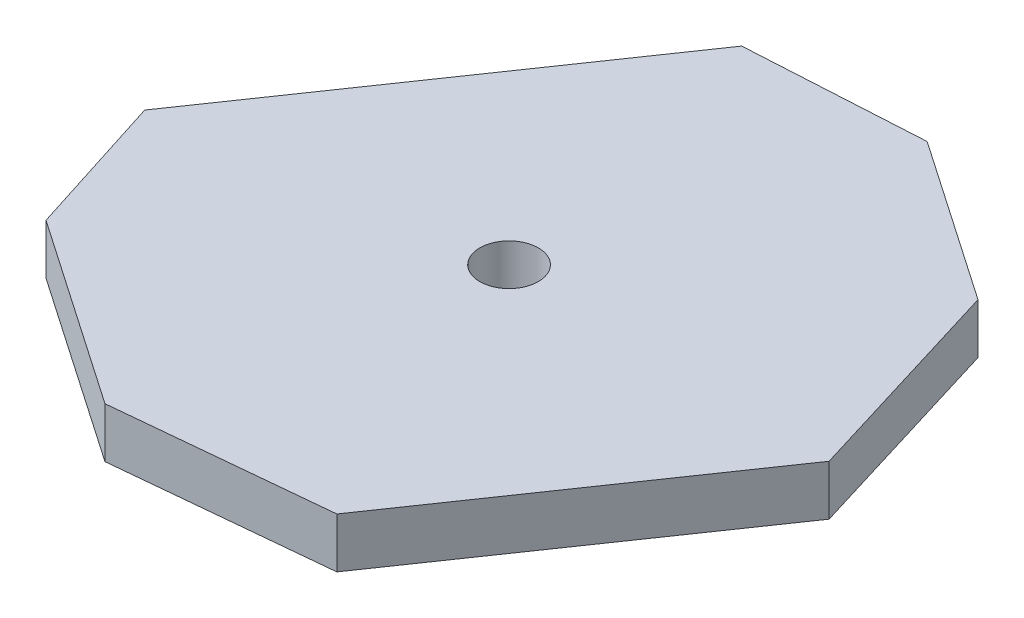
ISO-10303-21;
HEADER;
FILE_DESCRIPTION(('STEP AP214'),'2;1');
FILE_NAME('part.step','',(''),(''),'','','');
FILE_SCHEMA(('AUTOMOTIVE_DESIGN { 1 0 10303 214 1 1 1 1 }'));
ENDSEC;
DATA;
#1=APPLICATION_CONTEXT('core data for automotive mechanical design processes');
#2=APPLICATION_PROTOCOL_DEFINITION('international standard','automotive_design',2000,#1);
#3=PRODUCT_CONTEXT('',#1,'mechanical');
#4=PRODUCT('Part','Part','',(#3));
#5=PRODUCT_RELATED_PRODUCT_CATEGORY('part','',(#4));
#6=PRODUCT_DEFINITION_FORMATION('','',#4);
#7=PRODUCT_DEFINITION_CONTEXT('part definition',#1,'design');
#8=PRODUCT_DEFINITION('design','',#6,#7);
#9=PRODUCT_DEFINITION_SHAPE('','',#8);
#10=(LENGTH_UNIT() NAMED_UNIT(*) SI_UNIT(.MILLI.,.METRE.));
#11=(NAMED_UNIT(*) PLANE_ANGLE_UNIT() SI_UNIT($,.RADIAN.));
#12=(NAMED_UNIT(*) SI_UNIT($,.STERADIAN.) SOLID_ANGLE_UNIT());
#13=UNCERTAINTY_MEASURE_WITH_UNIT(LENGTH_MEASURE(1.E-05),#10,'distance_accuracy_value','');
#14=(GEOMETRIC_REPRESENTATION_CONTEXT(3) GLOBAL_UNCERTAINTY_ASSIGNED_CONTEXT((#13)) GLOBAL_UNIT_ASSIGNED_CONTEXT((#10,
#11,#12)) REPRESENTATION_CONTEXT('',''));
#15=CARTESIAN_POINT('',(0.,0.,0.));
#16=DIRECTION('',(0.,0.,1.));
#17=DIRECTION('',(1.,0.,0.));
#18=AXIS2_PLACEMENT_3D('',#15,#16,#17);
#19=CARTESIAN_POINT('',(0.,20.,0.));
#20=DIRECTION('',(0.,-1.,0.));
#21=DIRECTION('',(0.,0.,-1.));
#22=AXIS2_PLACEMENT_3D('',#19,#20,#21);
#23=CYLINDRICAL_SURFACE('',#22,9.);
#24=CARTESIAN_POINT('',(0.,7.,0.));
#25=DIRECTION('',(0.,1.,0.));
#26=DIRECTION('',(0.,0.,1.));
#27=AXIS2_PLACEMENT_3D('',#24,#25,#26);
#28=CIRCLE('',#27,9.);
#29=CARTESIAN_POINT('',(0.,7.,-9.));
#30=VERTEX_POINT('',#29);
#31=EDGE_CURVE('E148',#30,#30,#28,.T.);
#32=CARTESIAN_POINT('',(0.,12.,0.));
#33=DIRECTION('',(0.,1.,0.));
#34=DIRECTION('',(0.,0.,1.));
#35=AXIS2_PLACEMENT_3D('',#32,#33,#34);
#36=CIRCLE('',#35,9.);
#37=CARTESIAN_POINT('',(0.,12.,-9.));
#38=VERTEX_POINT('',#37);
#39=EDGE_CURVE('E189',#38,#38,#36,.T.);
#40=CARTESIAN_POINT('',(0.,7.,-9.));
#41=CARTESIAN_POINT('',(0.,7.05208333333333,-9.));
#42=CARTESIAN_POINT('',(0.,7.10416666666667,-9.));
#43=CARTESIAN_POINT('',(0.,7.20833333333333,-9.));
#44=CARTESIAN_POINT('',(0.,7.26041666666667,-9.));
#45=CARTESIAN_POINT('',(0.,7.36458333333333,-9.));
#46=CARTESIAN_POINT('',(0.,7.41666666666667,-9.));
#47=CARTESIAN_POINT('',(0.,7.52083333333333,-9.));
#48=CARTESIAN_POINT('',(0.,7.57291666666667,-9.));
#49=CARTESIAN_POINT('',(0.,7.67708333333333,-9.));
#50=CARTESIAN_POINT('',(0.,7.72916666666667,-9.));
#51=CARTESIAN_POINT('',(0.,7.83333333333333,-9.));
#52=CARTESIAN_POINT('',(0.,7.88541666666667,-9.));
#53=CARTESIAN_POINT('',(0.,7.98958333333333,-9.));
#54=CARTESIAN_POINT('',(0.,8.04166666666667,-9.));
#55=CARTESIAN_POINT('',(0.,8.14583333333333,-9.));
#56=CARTESIAN_POINT('',(0.,8.19791666666667,-9.));
#57=CARTESIAN_POINT('',(0.,8.30208333333333,-9.));
#58=CARTESIAN_POINT('',(0.,8.35416666666667,-9.));
#59=CARTESIAN_POINT('',(0.,8.45833333333333,-9.));
#60=CARTESIAN_POINT('',(0.,8.51041666666667,-9.));
#61=CARTESIAN_POINT('',(0.,8.61458333333333,-9.));
#62=CARTESIAN_POINT('',(0.,8.66666666666667,-9.));
#63=CARTESIAN_POINT('',(0.,8.77083333333333,-9.));
#64=CARTESIAN_POINT('',(0.,8.82291666666667,-9.));
#65=CARTESIAN_POINT('',(0.,8.92708333333333,-9.));
#66=CARTESIAN_POINT('',(0.,8.97916666666667,-9.));
#67=CARTESIAN_POINT('',(0.,9.08333333333333,-9.));
#68=CARTESIAN_POINT('',(0.,9.13541666666667,-9.));
#69=CARTESIAN_POINT('',(0.,9.23958333333333,-9.));
#70=CARTESIAN_POINT('',(0.,9.29166666666667,-9.));
#71=CARTESIAN_POINT('',(0.,9.39583333333333,-9.));
#72=CARTESIAN_POINT('',(0.,9.44791666666667,-9.));
#73=CARTESIAN_POINT('',(0.,9.55208333333333,-9.));
#74=CARTESIAN_POINT('',(0.,9.60416666666667,-9.));
#75=CARTESIAN_POINT('',(0.,9.70833333333333,-9.));
#76=CARTESIAN_POINT('',(0.,9.76041666666667,-9.));
#77=CARTESIAN_POINT('',(0.,9.86458333333333,-9.));
#78=CARTESIAN_POINT('',(0.,9.91666666666667,-9.));
#79=CARTESIAN_POINT('',(0.,10.0208333333333,-9.));
#80=CARTESIAN_POINT('',(0.,10.0729166666667,-9.));
#81=CARTESIAN_POINT('',(0.,10.1770833333333,-9.));
#82=CARTESIAN_POINT('',(0.,10.2291666666667,-9.));
#83=CARTESIAN_POINT('',(0.,10.3333333333333,-9.));
#84=CARTESIAN_POINT('',(0.,10.3854166666667,-9.));
#85=CARTESIAN_POINT('',(0.,10.4895833333333,-9.));
#86=CARTESIAN_POINT('',(0.,10.5416666666667,-9.));
#87=CARTESIAN_POINT('',(0.,10.6458333333333,-9.));
#88=CARTESIAN_POINT('',(0.,10.6979166666667,-9.));
#89=CARTESIAN_POINT('',(0.,10.8020833333333,-9.));
#90=CARTESIAN_POINT('',(0.,10.8541666666667,-9.));
#91=CARTESIAN_POINT('',(0.,10.9583333333333,-9.));
#92=CARTESIAN_POINT('',(0.,11.0104166666667,-9.));
#93=CARTESIAN_POINT('',(0.,11.1145833333333,-9.));
#94=CARTESIAN_POINT('',(0.,11.1666666666667,-9.));
#95=CARTESIAN_POINT('',(0.,11.2708333333333,-9.));
#96=CARTESIAN_POINT('',(0.,11.3229166666667,-9.));
#97=CARTESIAN_POINT('',(0.,11.4270833333333,-9.));
#98=CARTESIAN_POINT('',(0.,11.4791666666667,-9.));
#99=CARTESIAN_POINT('',(0.,11.5833333333333,-9.));
#100=CARTESIAN_POINT('',(0.,11.6354166666667,-9.));
#101=CARTESIAN_POINT('',(0.,11.7395833333333,-9.));
#102=CARTESIAN_POINT('',(0.,11.7916666666667,-9.));
#103=CARTESIAN_POINT('',(0.,11.8958333333333,-9.));
#104=CARTESIAN_POINT('',(0.,11.9479166666667,-9.));
#105=CARTESIAN_POINT('',(0.,12.,-9.));
#106=B_SPLINE_CURVE_WITH_KNOTS('',3,(#40,#41,#42,#43,#44,#45,#46,#47,#48,#49,#50,#51,#52,#53,
#54,#55,#56,#57,#58,#59,#60,#61,#62,#63,#64,#65,#66,#67,#68,#69,#70,#71,#72,#73,#74,#75,#76,#77,
#78,#79,#80,#81,#82,#83,#84,#85,#86,#87,#88,#89,#90,#91,#92,#93,#94,#95,#96,#97,#98,#99,#100,
#101,#102,#103,#104,#105),.UNSPECIFIED.,.F.,.F.,(4,2,2,2,2,2,2,2,2,2,2,2,2,2,2,2,2,2,2,2,2,2,2,
2,2,2,2,2,2,2,2,2,4),(0.,0.15625,0.3125,0.46875,0.625000000000001,0.781249999999999,
0.937499999999999,1.09375,1.25,1.40625,1.5625,1.71875,1.875,2.03125,2.1875,2.34375,2.5,2.65625,
2.8125,2.96875,3.125,3.28125,3.4375,3.59375,3.75,3.90625,4.0625,4.21875,4.375,4.53125,4.6875,
4.84375,5.),.UNSPECIFIED.);
#107=EDGE_CURVE('BSEAM31',#30,#38,#106,.T.);
#108=ORIENTED_EDGE('',*,*,#31,.F.);
#109=ORIENTED_EDGE('',*,*,#39,.T.);
#110=ORIENTED_EDGE('',*,*,#107,.T.);
#111=ORIENTED_EDGE('',*,*,#107,.F.);
#112=EDGE_LOOP('',(#108,#110,#109,#111));
#113=FACE_BOUND('',#112,.T.);
#114=ADVANCED_FACE('F31',(#113),#23,.F.);
#115=CARTESIAN_POINT('',(0.,20.,0.));
#116=DIRECTION('',(0.,1.,0.));
#117=DIRECTION('',(0.,0.,1.));
#118=AXIS2_PLACEMENT_3D('',#115,#116,#117);
#119=PLANE('',#118);
#120=DIRECTION('',(-0.998353627598779,0.,0.057358820249011));
#121=VECTOR('',#120,1.);
#122=CARTESIAN_POINT('',(-8.73290988352039,20.,-36.5474704589782));
#123=LINE('',#122,#121);
#124=CARTESIAN_POINT('',(12.2357602972844,20.,-37.7521920631401));
#125=VERTEX_POINT('',#124);
#126=CARTESIAN_POINT('',(-8.73290988352039,20.,-36.5474704589782));
#127=VERTEX_POINT('',#126);
#128=EDGE_CURVE('E132',#125,#127,#123,.T.);
#129=ORIENTED_EDGE('',*,*,#128,.T.);
#130=DIRECTION('',(-0.566202026854312,0.,0.824266501069932));
#131=VECTOR('',#130,1.);
#132=CARTESIAN_POINT('',(-37.7975580707269,20.,5.76431001838409));
#133=LINE('',#132,#131);
#134=CARTESIAN_POINT('',(-37.7975580707269,20.,5.76431001838409));
#135=VERTEX_POINT('',#134);
#136=EDGE_CURVE('E121',#127,#135,#133,.T.);
#137=ORIENTED_EDGE('',*,*,#136,.T.);
#138=DIRECTION('',(0.303356932104085,0.,0.952876997174556));
#139=VECTOR('',#138,1.);
#140=CARTESIAN_POINT('',(-32.2858374379566,20.,23.0772218064594));
#141=LINE('',#140,#139);
#142=CARTESIAN_POINT('',(-32.2858374379566,20.,23.0772218064594));
#143=VERTEX_POINT('',#142);
#144=EDGE_CURVE('E119',#135,#143,#141,.T.);
#145=ORIENTED_EDGE('',*,*,#144,.T.);
#146=DIRECTION('',(0.824266501069933,0.,0.566202026854312));
#147=VECTOR('',#146,1.);
#148=CARTESIAN_POINT('',(-9.7668889099382,20.,38.5458527439554));
#149=LINE('',#148,#147);
#150=CARTESIAN_POINT('',(-9.7668889099382,20.,38.5458527439554));
#151=VERTEX_POINT('',#150);
#152=EDGE_CURVE('E46',#143,#151,#149,.T.);
#153=ORIENTED_EDGE('',*,*,#152,.T.);
#154=DIRECTION('',(0.995356215545695,0.,-0.0962600860925825));
#155=VECTOR('',#154,1.);
#156=CARTESIAN_POINT('',(-9.7668889099382,20.,38.5458527439554));
#157=LINE('',#156,#155);
#158=CARTESIAN_POINT('',(15.5126441693851,20.,36.1010897610249));
#159=VERTEX_POINT('',#158);
#160=EDGE_CURVE('E106',#151,#159,#157,.T.);
#161=ORIENTED_EDGE('',*,*,#160,.T.);
#162=DIRECTION('',(0.566202026854312,0.,-0.824266501069932));
#163=VECTOR('',#162,1.);
#164=CARTESIAN_POINT('',(15.5126441693851,20.,36.1010897610249));
#165=LINE('',#164,#163);
#166=CARTESIAN_POINT('',(39.4774671890436,20.,1.21354100229039));
#167=VERTEX_POINT('',#166);
#168=EDGE_CURVE('E112',#159,#167,#165,.T.);
#169=ORIENTED_EDGE('',*,*,#168,.T.);
#170=DIRECTION('',(-0.292112381317612,0.,-0.956384000640409));
#171=VECTOR('',#170,1.);
#172=CARTESIAN_POINT('',(39.4774671890436,20.,1.21354100229039));
#173=LINE('',#172,#171);
#174=CARTESIAN_POINT('',(31.6490594515686,20.,-24.4168820453041));
#175=VERTEX_POINT('',#174);
#176=EDGE_CURVE('E126',#167,#175,#173,.T.);
#177=ORIENTED_EDGE('',*,*,#176,.T.);
#178=DIRECTION('',(-0.824266501069941,0.,-0.566202026854299));
#179=VECTOR('',#178,1.);
#180=CARTESIAN_POINT('',(31.6490594515686,20.,-24.4168820453041));
#181=LINE('',#180,#179);
#182=EDGE_CURVE('E129',#175,#125,#181,.T.);
#183=ORIENTED_EDGE('',*,*,#182,.T.);
#184=EDGE_LOOP('',(#129,#137,#145,#153,#161,#169,#177,#183));
#185=FACE_BOUND('',#184,.T.);
#186=CARTESIAN_POINT('',(0.,20.,0.));
#187=DIRECTION('',(0.,1.,0.));
#188=DIRECTION('',(0.,0.,1.));
#189=AXIS2_PLACEMENT_3D('',#186,#187,#188);
#190=CIRCLE('',#189,3.5);
#191=CARTESIAN_POINT('',(0.,20.,3.5));
#192=VERTEX_POINT('',#191);
#193=EDGE_CURVE('E194',#192,#192,#190,.T.);
#194=ORIENTED_EDGE('',*,*,#193,.F.);
#195=EDGE_LOOP('',(#194));
#196=FACE_BOUND('',#195,.T.);
#197=ADVANCED_FACE('F116',(#185,#196),#119,.T.);
#198=CARTESIAN_POINT('',(0.,14.,0.));
#199=DIRECTION('',(0.,-1.,0.));
#200=DIRECTION('',(0.,0.,-1.));
#201=AXIS2_PLACEMENT_3D('',#198,#199,#200);
#202=PLANE('',#201);
#203=CARTESIAN_POINT('',(0.,14.,0.));
#204=DIRECTION('',(0.,-1.,0.));
#205=DIRECTION('',(0.,0.,-1.));
#206=AXIS2_PLACEMENT_3D('',#203,#204,#205);
#207=CIRCLE('',#206,25.);
#208=CARTESIAN_POINT('',(0.,14.,-25.));
#209=VERTEX_POINT('',#208);
#210=EDGE_CURVE('E11',#209,#209,#207,.F.);
#211=ORIENTED_EDGE('',*,*,#210,.T.);
#212=EDGE_LOOP('',(#211));
#213=FACE_BOUND('',#212,.T.);
#214=DIRECTION('',(-0.303356932104085,0.,-0.952876997174556));
#215=VECTOR('',#214,1.);
#216=CARTESIAN_POINT('',(-35.9854636771118,14.,11.4562948773039));
#217=LINE('',#216,#215);
#218=CARTESIAN_POINT('',(-32.2858374379566,14.,23.0772218064594));
#219=VERTEX_POINT('',#218);
#220=CARTESIAN_POINT('',(-37.7975580707269,14.,5.76431001838409));
#221=VERTEX_POINT('',#220);
#222=EDGE_CURVE('E151',#219,#221,#217,.T.);
#223=ORIENTED_EDGE('',*,*,#222,.T.);
#224=DIRECTION('',(0.566202026854312,0.,-0.824266501069932));
#225=VECTOR('',#224,1.);
#226=CARTESIAN_POINT('',(-22.9900265792471,14.,-15.7922220904375));
#227=LINE('',#226,#225);
#228=CARTESIAN_POINT('',(-8.73290988352039,14.,-36.5474704589782));
#229=VERTEX_POINT('',#228);
#230=EDGE_CURVE('E39',#221,#229,#227,.T.);
#231=ORIENTED_EDGE('',*,*,#230,.T.);
#232=DIRECTION('',(0.998353627598779,0.,-0.057358820249011));
#233=VECTOR('',#232,1.);
#234=CARTESIAN_POINT('',(-2.12160003827787,14.,-36.9273127538732));
#235=LINE('',#234,#233);
#236=CARTESIAN_POINT('',(12.2357602972844,14.,-37.7521920631401));
#237=VERTEX_POINT('',#236);
#238=EDGE_CURVE('E166',#229,#237,#235,.T.);
#239=ORIENTED_EDGE('',*,*,#238,.T.);
#240=DIRECTION('',(0.824266501069941,0.,0.566202026854299));
#241=VECTOR('',#240,1.);
#242=CARTESIAN_POINT('',(21.5415974888172,14.,-31.3598615819394));
#243=LINE('',#242,#241);
#244=CARTESIAN_POINT('',(31.6490594515686,14.,-24.4168820453041));
#245=VERTEX_POINT('',#244);
#246=EDGE_CURVE('E163',#237,#245,#243,.T.);
#247=ORIENTED_EDGE('',*,*,#246,.T.);
#248=DIRECTION('',(0.292112381317612,0.,0.956384000640409));
#249=VECTOR('',#248,1.);
#250=CARTESIAN_POINT('',(35.7698400936236,14.,-10.9253324627994));
#251=LINE('',#250,#249);
#252=CARTESIAN_POINT('',(39.4774671890436,14.,1.21354100229039));
#253=VERTEX_POINT('',#252);
#254=EDGE_CURVE('E160',#245,#253,#251,.T.);
#255=ORIENTED_EDGE('',*,*,#254,.T.);
#256=DIRECTION('',(-0.566202026854312,0.,0.824266501069932));
#257=VECTOR('',#256,1.);
#258=CARTESIAN_POINT('',(27.3879550638492,14.,18.8132304884614));
#259=LINE('',#258,#257);
#260=CARTESIAN_POINT('',(15.5126441693851,14.,36.1010897610249));
#261=VERTEX_POINT('',#260);
#262=EDGE_CURVE('E157',#253,#261,#259,.T.);
#263=ORIENTED_EDGE('',*,*,#262,.T.);
#264=DIRECTION('',(-0.995356215545695,0.,0.0962600860925825));
#265=VECTOR('',#264,1.);
#266=CARTESIAN_POINT('',(3.60269664653055,14.,37.2528910518618));
#267=LINE('',#266,#265);
#268=CARTESIAN_POINT('',(-9.7668889099382,14.,38.5458527439554));
#269=VERTEX_POINT('',#268);
#270=EDGE_CURVE('E155',#261,#269,#267,.T.);
#271=ORIENTED_EDGE('',*,*,#270,.T.);
#272=DIRECTION('',(-0.824266501069933,0.,-0.566202026854312));
#273=VECTOR('',#272,1.);
#274=CARTESIAN_POINT('',(-21.1205175307794,14.,30.7468611205823));
#275=LINE('',#274,#273);
#276=EDGE_CURVE('E99',#269,#219,#275,.T.);
#277=ORIENTED_EDGE('',*,*,#276,.T.);
#278=EDGE_LOOP('',(#223,#231,#239,#247,#255,#263,#271,#277));
#279=FACE_BOUND('',#278,.T.);
#280=ADVANCED_FACE('F170',(#213,#279),#202,.T.);
#281=CARTESIAN_POINT('',(0.,7.,0.));
#282=DIRECTION('',(0.,1.,0.));
#283=DIRECTION('',(0.,0.,1.));
#284=AXIS2_PLACEMENT_3D('',#281,#282,#283);
#285=PLANE('',#284);
#286=ORIENTED_EDGE('',*,*,#31,.T.);
#287=EDGE_LOOP('',(#286));
#288=FACE_BOUND('',#287,.T.);
#289=CARTESIAN_POINT('',(0.,7.,0.));
#290=DIRECTION('',(0.,-1.,0.));
#291=DIRECTION('',(0.,0.,-1.));
#292=AXIS2_PLACEMENT_3D('',#289,#290,#291);
#293=CIRCLE('',#292,18.);
#294=CARTESIAN_POINT('',(0.,7.,-18.));
#295=VERTEX_POINT('',#294);
#296=EDGE_CURVE('E136',#295,#295,#293,.T.);
#297=ORIENTED_EDGE('',*,*,#296,.T.);
#298=EDGE_LOOP('',(#297));
#299=FACE_BOUND('',#298,.T.);
#300=ADVANCED_FACE('F214',(#288,#299),#285,.F.);
#301=CARTESIAN_POINT('',(-37.7975580707269,10.,5.76431001838409));
#302=DIRECTION('',(-0.824266501069932,0.,-0.566202026854312));
#303=DIRECTION('',(-0.566202026854312,0.,0.824266501069932));
#304=AXIS2_PLACEMENT_3D('',#301,#302,#303);
#305=PLANE('',#304);
#306=DIRECTION('',(0.,1.,0.));
#307=VECTOR('',#306,1.);
#308=CARTESIAN_POINT('',(-37.7975580707269,10.,5.76431001838409));
#309=LINE('',#308,#307);
#310=EDGE_CURVE('E54',#221,#135,#309,.T.);
#311=ORIENTED_EDGE('',*,*,#310,.T.);
#312=ORIENTED_EDGE('',*,*,#136,.F.);
#313=DIRECTION('',(0.,1.,0.));
#314=VECTOR('',#313,1.);
#315=CARTESIAN_POINT('',(-8.73290988352039,10.,-36.5474704589782));
#316=LINE('',#315,#314);
#317=EDGE_CURVE('E134',#229,#127,#316,.T.);
#318=ORIENTED_EDGE('',*,*,#317,.F.);
#319=ORIENTED_EDGE('',*,*,#230,.F.);
#320=EDGE_LOOP('',(#311,#312,#318,#319));
#321=FACE_BOUND('',#320,.T.);
#322=ADVANCED_FACE('F173',(#321),#305,.T.);
#323=CARTESIAN_POINT('',(-8.73290988352039,10.,-36.5474704589782));
#324=DIRECTION('',(-0.057358820249011,0.,-0.998353627598779));
#325=DIRECTION('',(-0.998353627598779,0.,0.057358820249011));
#326=AXIS2_PLACEMENT_3D('',#323,#324,#325);
#327=PLANE('',#326);
#328=ORIENTED_EDGE('',*,*,#317,.T.);
#329=ORIENTED_EDGE('',*,*,#128,.F.);
#330=DIRECTION('',(0.,1.,0.));
#331=VECTOR('',#330,1.);
#332=CARTESIAN_POINT('',(12.2357602972844,10.,-37.7521920631401));
#333=LINE('',#332,#331);
#334=EDGE_CURVE('E137',#237,#125,#333,.T.);
#335=ORIENTED_EDGE('',*,*,#334,.F.);
#336=ORIENTED_EDGE('',*,*,#238,.F.);
#337=EDGE_LOOP('',(#328,#329,#335,#336));
#338=FACE_BOUND('',#337,.T.);
#339=ADVANCED_FACE('F177',(#338),#327,.T.);
#340=CARTESIAN_POINT('',(31.6490594515686,10.,-24.4168820453041));
#341=DIRECTION('',(0.566202026854299,0.,-0.824266501069941));
#342=DIRECTION('',(-0.824266501069941,0.,-0.566202026854299));
#343=AXIS2_PLACEMENT_3D('',#340,#341,#342);
#344=PLANE('',#343);
#345=ORIENTED_EDGE('',*,*,#334,.T.);
#346=ORIENTED_EDGE('',*,*,#182,.F.);
#347=DIRECTION('',(0.,1.,0.));
#348=VECTOR('',#347,1.);
#349=CARTESIAN_POINT('',(31.6490594515686,10.,-24.4168820453041));
#350=LINE('',#349,#348);
#351=EDGE_CURVE('E139',#245,#175,#350,.T.);
#352=ORIENTED_EDGE('',*,*,#351,.F.);
#353=ORIENTED_EDGE('',*,*,#246,.F.);
#354=EDGE_LOOP('',(#345,#346,#352,#353));
#355=FACE_BOUND('',#354,.T.);
#356=ADVANCED_FACE('F181',(#355),#344,.T.);
#357=CARTESIAN_POINT('',(39.4774671890436,10.,1.21354100229039));
#358=DIRECTION('',(0.956384000640409,0.,-0.292112381317612));
#359=DIRECTION('',(-0.292112381317612,0.,-0.956384000640409));
#360=AXIS2_PLACEMENT_3D('',#357,#358,#359);
#361=PLANE('',#360);
#362=ORIENTED_EDGE('',*,*,#351,.T.);
#363=ORIENTED_EDGE('',*,*,#176,.F.);
#364=DIRECTION('',(0.,1.,0.));
#365=VECTOR('',#364,1.);
#366=CARTESIAN_POINT('',(39.4774671890436,10.,1.21354100229039));
#367=LINE('',#366,#365);
#368=EDGE_CURVE('E141',#253,#167,#367,.T.);
#369=ORIENTED_EDGE('',*,*,#368,.F.);
#370=ORIENTED_EDGE('',*,*,#254,.F.);
#371=EDGE_LOOP('',(#362,#363,#369,#370));
#372=FACE_BOUND('',#371,.T.);
#373=ADVANCED_FACE('F185',(#372),#361,.T.);
#374=CARTESIAN_POINT('',(15.5126441693851,10.,36.1010897610249));
#375=DIRECTION('',(0.824266501069932,0.,0.566202026854312));
#376=DIRECTION('',(0.566202026854312,0.,-0.824266501069932));
#377=AXIS2_PLACEMENT_3D('',#374,#375,#376);
#378=PLANE('',#377);
#379=ORIENTED_EDGE('',*,*,#368,.T.);
#380=ORIENTED_EDGE('',*,*,#168,.F.);
#381=DIRECTION('',(0.,1.,0.));
#382=VECTOR('',#381,1.);
#383=CARTESIAN_POINT('',(15.5126441693851,10.,36.1010897610249));
#384=LINE('',#383,#382);
#385=EDGE_CURVE('E102',#261,#159,#384,.T.);
#386=ORIENTED_EDGE('',*,*,#385,.F.);
#387=ORIENTED_EDGE('',*,*,#262,.F.);
#388=EDGE_LOOP('',(#379,#380,#386,#387));
#389=FACE_BOUND('',#388,.T.);
#390=ADVANCED_FACE('F188',(#389),#378,.T.);
#391=CARTESIAN_POINT('',(-9.7668889099382,10.,38.5458527439554));
#392=DIRECTION('',(0.0962600860925825,0.,0.995356215545695));
#393=DIRECTION('',(0.995356215545695,0.,-0.0962600860925825));
#394=AXIS2_PLACEMENT_3D('',#391,#392,#393);
#395=PLANE('',#394);
#396=ORIENTED_EDGE('',*,*,#385,.T.);
#397=ORIENTED_EDGE('',*,*,#160,.F.);
#398=DIRECTION('',(0.,1.,0.));
#399=VECTOR('',#398,1.);
#400=CARTESIAN_POINT('',(-9.7668889099382,10.,38.5458527439554));
#401=LINE('',#400,#399);
#402=EDGE_CURVE('E95',#269,#151,#401,.T.);
#403=ORIENTED_EDGE('',*,*,#402,.F.);
#404=ORIENTED_EDGE('',*,*,#270,.F.);
#405=EDGE_LOOP('',(#396,#397,#403,#404));
#406=FACE_BOUND('',#405,.T.);
#407=ADVANCED_FACE('F107',(#406),#395,.T.);
#408=CARTESIAN_POINT('',(-9.7668889099382,10.,38.5458527439554));
#409=DIRECTION('',(-0.566202026854312,0.,0.824266501069933));
#410=DIRECTION('',(0.824266501069933,0.,0.566202026854312));
#411=AXIS2_PLACEMENT_3D('',#408,#409,#410);
#412=PLANE('',#411);
#413=ORIENTED_EDGE('',*,*,#402,.T.);
#414=ORIENTED_EDGE('',*,*,#152,.F.);
#415=DIRECTION('',(0.,1.,0.));
#416=VECTOR('',#415,1.);
#417=CARTESIAN_POINT('',(-32.2858374379566,10.,23.0772218064594));
#418=LINE('',#417,#416);
#419=EDGE_CURVE('E103',#219,#143,#418,.T.);
#420=ORIENTED_EDGE('',*,*,#419,.F.);
#421=ORIENTED_EDGE('',*,*,#276,.F.);
#422=EDGE_LOOP('',(#413,#414,#420,#421));
#423=FACE_BOUND('',#422,.T.);
#424=ADVANCED_FACE('F97',(#423),#412,.T.);
#425=CARTESIAN_POINT('',(-32.2858374379566,10.,23.0772218064594));
#426=DIRECTION('',(-0.952876997174556,0.,0.303356932104085));
#427=DIRECTION('',(0.303356932104085,0.,0.952876997174556));
#428=AXIS2_PLACEMENT_3D('',#425,#426,#427);
#429=PLANE('',#428);
#430=ORIENTED_EDGE('',*,*,#419,.T.);
#431=ORIENTED_EDGE('',*,*,#144,.F.);
#432=ORIENTED_EDGE('',*,*,#310,.F.);
#433=ORIENTED_EDGE('',*,*,#222,.F.);
#434=EDGE_LOOP('',(#430,#431,#432,#433));
#435=FACE_BOUND('',#434,.T.);
#436=ADVANCED_FACE('F245',(#435),#429,.T.);
#437=CARTESIAN_POINT('',(0.,12.,0.));
#438=DIRECTION('',(0.,1.,0.));
#439=DIRECTION('',(0.,0.,1.));
#440=AXIS2_PLACEMENT_3D('',#437,#438,#439);
#441=PLANE('',#440);
#442=CARTESIAN_POINT('',(0.,12.,0.));
#443=DIRECTION('',(0.,1.,0.));
#444=DIRECTION('',(0.,0.,1.));
#445=AXIS2_PLACEMENT_3D('',#442,#443,#444);
#446=CIRCLE('',#445,3.5);
#447=CARTESIAN_POINT('',(0.,12.,3.5));
#448=VERTEX_POINT('',#447);
#449=EDGE_CURVE('E191',#448,#448,#446,.T.);
#450=ORIENTED_EDGE('',*,*,#449,.T.);
#451=EDGE_LOOP('',(#450));
#452=FACE_BOUND('',#451,.T.);
#453=ORIENTED_EDGE('',*,*,#39,.F.);
#454=EDGE_LOOP('',(#453));
#455=FACE_BOUND('',#454,.T.);
#456=ADVANCED_FACE('F200',(#452,#455),#441,.F.);
#457=CARTESIAN_POINT('',(0.,12.,0.));
#458=DIRECTION('',(0.,1.,0.));
#459=DIRECTION('',(0.,0.,1.));
#460=AXIS2_PLACEMENT_3D('',#457,#458,#459);
#461=CYLINDRICAL_SURFACE('',#460,3.5);
#462=ORIENTED_EDGE('',*,*,#449,.F.);
#463=EDGE_LOOP('',(#462));
#464=FACE_BOUND('',#463,.T.);
#465=ORIENTED_EDGE('',*,*,#193,.T.);
#466=EDGE_LOOP('',(#465));
#467=FACE_BOUND('',#466,.T.);
#468=ADVANCED_FACE('F203',(#464,#467),#461,.F.);
#469=CARTESIAN_POINT('',(0.,7.,0.));
#470=DIRECTION('',(0.,-1.,0.));
#471=DIRECTION('',(0.,0.,-1.));
#472=AXIS2_PLACEMENT_3D('',#469,#470,#471);
#473=TOROIDAL_SURFACE('',#472,25.,7.);
#474=ORIENTED_EDGE('',*,*,#210,.F.);
#475=EDGE_LOOP('',(#474));
#476=FACE_BOUND('',#475,.T.);
#477=ORIENTED_EDGE('',*,*,#296,.F.);
#478=EDGE_LOOP('',(#477));
#479=FACE_BOUND('',#478,.T.);
#480=ADVANCED_FACE('F33',(#476,#479),#473,.F.);
#481=CLOSED_SHELL('',(#114,#197,#280,#300,#322,#339,#356,#373,#390,#407,#424,#436,#456,#468,#480));
#482=MANIFOLD_SOLID_BREP('B2',#481);
#483=ADVANCED_BREP_SHAPE_REPRESENTATION('',(#18,#482),#14);
#484=SHAPE_DEFINITION_REPRESENTATION(#9,#483);
ENDSEC;
END-ISO-10303-21;
